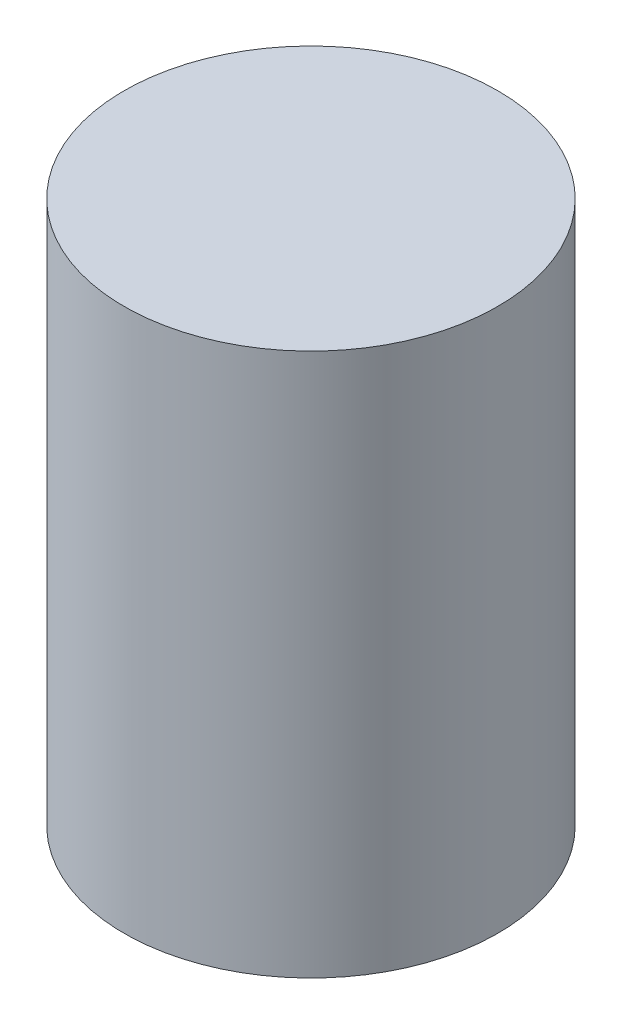
ISO-10303-21;
HEADER;
FILE_DESCRIPTION(('STEP AP214'),'2;1');
FILE_NAME('part.step','',(''),(''),'','','');
FILE_SCHEMA(('AUTOMOTIVE_DESIGN { 1 0 10303 214 1 1 1 1 }'));
ENDSEC;
DATA;
#1=APPLICATION_CONTEXT('core data for automotive mechanical design processes');
#2=APPLICATION_PROTOCOL_DEFINITION('international standard','automotive_design',2000,#1);
#3=PRODUCT_CONTEXT('',#1,'mechanical');
#4=PRODUCT('Part','Part','',(#3));
#5=PRODUCT_RELATED_PRODUCT_CATEGORY('part','',(#4));
#6=PRODUCT_DEFINITION_FORMATION('','',#4);
#7=PRODUCT_DEFINITION_CONTEXT('part definition',#1,'design');
#8=PRODUCT_DEFINITION('design','',#6,#7);
#9=PRODUCT_DEFINITION_SHAPE('','',#8);
#10=(LENGTH_UNIT() NAMED_UNIT(*) SI_UNIT(.MILLI.,.METRE.));
#11=(NAMED_UNIT(*) PLANE_ANGLE_UNIT() SI_UNIT($,.RADIAN.));
#12=(NAMED_UNIT(*) SI_UNIT($,.STERADIAN.) SOLID_ANGLE_UNIT());
#13=UNCERTAINTY_MEASURE_WITH_UNIT(LENGTH_MEASURE(1.E-05),#10,'distance_accuracy_value','');
#14=(GEOMETRIC_REPRESENTATION_CONTEXT(3) GLOBAL_UNCERTAINTY_ASSIGNED_CONTEXT((#13)) GLOBAL_UNIT_ASSIGNED_CONTEXT((#10,
#11,#12)) REPRESENTATION_CONTEXT('',''));
#15=CARTESIAN_POINT('',(0.,0.,0.));
#16=DIRECTION('',(0.,0.,1.));
#17=DIRECTION('',(1.,0.,0.));
#18=AXIS2_PLACEMENT_3D('',#15,#16,#17);
#19=CARTESIAN_POINT('',(0.,46.2000092,0.));
#20=DIRECTION('',(0.,-1.,0.));
#21=DIRECTION('',(0.,0.,-1.));
#22=AXIS2_PLACEMENT_3D('',#19,#20,#21);
#23=CYLINDRICAL_SURFACE('',#22,15.9000063);
#24=CARTESIAN_POINT('',(0.,46.2000092,0.));
#25=DIRECTION('',(0.,1.,0.));
#26=DIRECTION('',(0.,0.,1.));
#27=AXIS2_PLACEMENT_3D('',#24,#25,#26);
#28=CIRCLE('',#27,15.9000063);
#29=CARTESIAN_POINT('',(0.,46.2000092,-15.9000063));
#30=VERTEX_POINT('',#29);
#31=EDGE_CURVE('E10',#30,#30,#28,.T.);
#32=CARTESIAN_POINT('',(0.,0.,0.));
#33=DIRECTION('',(0.,1.,0.));
#34=DIRECTION('',(0.,0.,1.));
#35=AXIS2_PLACEMENT_3D('',#32,#33,#34);
#36=CIRCLE('',#35,15.9000063);
#37=CARTESIAN_POINT('',(0.,0.,-15.9000063));
#38=VERTEX_POINT('',#37);
#39=EDGE_CURVE('E40',#38,#38,#36,.T.);
#40=CARTESIAN_POINT('',(0.,46.2000092,-15.9000063));
#41=CARTESIAN_POINT('',(0.,45.7187591041667,-15.9000063));
#42=CARTESIAN_POINT('',(0.,45.2375090083333,-15.9000063));
#43=CARTESIAN_POINT('',(0.,44.2750088166667,-15.9000063));
#44=CARTESIAN_POINT('',(0.,43.7937587208333,-15.9000063));
#45=CARTESIAN_POINT('',(0.,42.8312585291667,-15.9000063));
#46=CARTESIAN_POINT('',(0.,42.3500084333333,-15.9000063));
#47=CARTESIAN_POINT('',(0.,41.3875082416667,-15.9000063));
#48=CARTESIAN_POINT('',(0.,40.9062581458333,-15.9000063));
#49=CARTESIAN_POINT('',(0.,39.9437579541667,-15.9000063));
#50=CARTESIAN_POINT('',(0.,39.4625078583333,-15.9000063));
#51=CARTESIAN_POINT('',(0.,38.5000076666667,-15.9000063));
#52=CARTESIAN_POINT('',(0.,38.0187575708333,-15.9000063));
#53=CARTESIAN_POINT('',(0.,37.0562573791667,-15.9000063));
#54=CARTESIAN_POINT('',(0.,36.5750072833333,-15.9000063));
#55=CARTESIAN_POINT('',(0.,35.6125070916667,-15.9000063));
#56=CARTESIAN_POINT('',(0.,35.1312569958333,-15.9000063));
#57=CARTESIAN_POINT('',(0.,34.1687568041667,-15.9000063));
#58=CARTESIAN_POINT('',(0.,33.6875067083333,-15.9000063));
#59=CARTESIAN_POINT('',(0.,32.7250065166667,-15.9000063));
#60=CARTESIAN_POINT('',(0.,32.2437564208333,-15.9000063));
#61=CARTESIAN_POINT('',(0.,31.2812562291667,-15.9000063));
#62=CARTESIAN_POINT('',(0.,30.8000061333333,-15.9000063));
#63=CARTESIAN_POINT('',(0.,29.8375059416667,-15.9000063));
#64=CARTESIAN_POINT('',(0.,29.3562558458333,-15.9000063));
#65=CARTESIAN_POINT('',(0.,28.3937556541667,-15.9000063));
#66=CARTESIAN_POINT('',(0.,27.9125055583333,-15.9000063));
#67=CARTESIAN_POINT('',(0.,26.9500053666667,-15.9000063));
#68=CARTESIAN_POINT('',(0.,26.4687552708333,-15.9000063));
#69=CARTESIAN_POINT('',(0.,25.5062550791667,-15.9000063));
#70=CARTESIAN_POINT('',(0.,25.0250049833333,-15.9000063));
#71=CARTESIAN_POINT('',(0.,24.0625047916667,-15.9000063));
#72=CARTESIAN_POINT('',(0.,23.5812546958333,-15.9000063));
#73=CARTESIAN_POINT('',(0.,22.6187545041667,-15.9000063));
#74=CARTESIAN_POINT('',(0.,22.1375044083333,-15.9000063));
#75=CARTESIAN_POINT('',(0.,21.1750042166667,-15.9000063));
#76=CARTESIAN_POINT('',(0.,20.6937541208333,-15.9000063));
#77=CARTESIAN_POINT('',(0.,19.7312539291667,-15.9000063));
#78=CARTESIAN_POINT('',(0.,19.2500038333333,-15.9000063));
#79=CARTESIAN_POINT('',(0.,18.2875036416667,-15.9000063));
#80=CARTESIAN_POINT('',(0.,17.8062535458333,-15.9000063));
#81=CARTESIAN_POINT('',(0.,16.8437533541667,-15.9000063));
#82=CARTESIAN_POINT('',(0.,16.3625032583333,-15.9000063));
#83=CARTESIAN_POINT('',(0.,15.4000030666667,-15.9000063));
#84=CARTESIAN_POINT('',(0.,14.9187529708333,-15.9000063));
#85=CARTESIAN_POINT('',(0.,13.9562527791667,-15.9000063));
#86=CARTESIAN_POINT('',(0.,13.4750026833333,-15.9000063));
#87=CARTESIAN_POINT('',(0.,12.5125024916667,-15.9000063));
#88=CARTESIAN_POINT('',(0.,12.0312523958333,-15.9000063));
#89=CARTESIAN_POINT('',(0.,11.0687522041667,-15.9000063));
#90=CARTESIAN_POINT('',(0.,10.5875021083333,-15.9000063));
#91=CARTESIAN_POINT('',(0.,9.62500191666667,-15.9000063));
#92=CARTESIAN_POINT('',(0.,9.14375182083333,-15.9000063));
#93=CARTESIAN_POINT('',(0.,8.18125162916667,-15.9000063));
#94=CARTESIAN_POINT('',(0.,7.70000153333333,-15.9000063));
#95=CARTESIAN_POINT('',(0.,6.73750134166666,-15.9000063));
#96=CARTESIAN_POINT('',(0.,6.25625124583333,-15.9000063));
#97=CARTESIAN_POINT('',(0.,5.29375105416667,-15.9000063));
#98=CARTESIAN_POINT('',(0.,4.81250095833333,-15.9000063));
#99=CARTESIAN_POINT('',(0.,3.85000076666666,-15.9000063));
#100=CARTESIAN_POINT('',(0.,3.36875067083333,-15.9000063));
#101=CARTESIAN_POINT('',(0.,2.40625047916667,-15.9000063));
#102=CARTESIAN_POINT('',(0.,1.92500038333333,-15.9000063));
#103=CARTESIAN_POINT('',(0.,0.962500191666664,-15.9000063));
#104=CARTESIAN_POINT('',(0.,0.481250095833332,-15.9000063));
#105=CARTESIAN_POINT('',(0.,0.,-15.9000063));
#106=B_SPLINE_CURVE_WITH_KNOTS('',3,(#40,#41,#42,#43,#44,#45,#46,#47,#48,#49,#50,#51,#52,#53,
#54,#55,#56,#57,#58,#59,#60,#61,#62,#63,#64,#65,#66,#67,#68,#69,#70,#71,#72,#73,#74,#75,#76,#77,
#78,#79,#80,#81,#82,#83,#84,#85,#86,#87,#88,#89,#90,#91,#92,#93,#94,#95,#96,#97,#98,#99,#100,
#101,#102,#103,#104,#105),.UNSPECIFIED.,.F.,.F.,(4,2,2,2,2,2,2,2,2,2,2,2,2,2,2,2,2,2,2,2,2,2,2,
2,2,2,2,2,2,2,2,2,4),(0.,1.4437502875,2.88750057499999,4.3312508625,5.77500114999999,
7.2187514375,8.66250172499999,10.1062520125,11.5500023,12.9937525875,14.437502875,15.8812531625,
17.32500345,18.7687537375,20.212504025,21.6562543125,23.1000046,24.5437548875,25.987505175,
27.4312554625,28.87500575,30.3187560375,31.762506325,33.2062566125,34.6500069,36.0937571875,
37.537507475,38.9812577625,40.42500805,41.8687583375,43.312508625,44.7562589125,46.2000092),.UNSPECIFIED.);
#107=EDGE_CURVE('BSEAM37',#30,#38,#106,.T.);
#108=ORIENTED_EDGE('',*,*,#31,.F.);
#109=ORIENTED_EDGE('',*,*,#39,.T.);
#110=ORIENTED_EDGE('',*,*,#107,.T.);
#111=ORIENTED_EDGE('',*,*,#107,.F.);
#112=EDGE_LOOP('',(#108,#110,#109,#111));
#113=FACE_BOUND('',#112,.T.);
#114=ADVANCED_FACE('F37',(#113),#23,.T.);
#115=CARTESIAN_POINT('',(0.,46.2000092,0.));
#116=DIRECTION('',(0.,1.,0.));
#117=DIRECTION('',(0.,0.,1.));
#118=AXIS2_PLACEMENT_3D('',#115,#116,#117);
#119=PLANE('',#118);
#120=ORIENTED_EDGE('',*,*,#31,.T.);
#121=EDGE_LOOP('',(#120));
#122=FACE_BOUND('',#121,.T.);
#123=ADVANCED_FACE('F54',(#122),#119,.T.);
#124=CARTESIAN_POINT('',(0.,0.,0.));
#125=DIRECTION('',(0.,1.,0.));
#126=DIRECTION('',(0.,0.,1.));
#127=AXIS2_PLACEMENT_3D('',#124,#125,#126);
#128=PLANE('',#127);
#129=ORIENTED_EDGE('',*,*,#39,.F.);
#130=EDGE_LOOP('',(#129));
#131=FACE_BOUND('',#130,.T.);
#132=ADVANCED_FACE('F52',(#131),#128,.F.);
#133=CLOSED_SHELL('',(#114,#123,#132));
#134=MANIFOLD_SOLID_BREP('B2',#133);
#135=ADVANCED_BREP_SHAPE_REPRESENTATION('',(#18,#134),#14);
#136=SHAPE_DEFINITION_REPRESENTATION(#9,#135);
ENDSEC;
END-ISO-10303-21;
